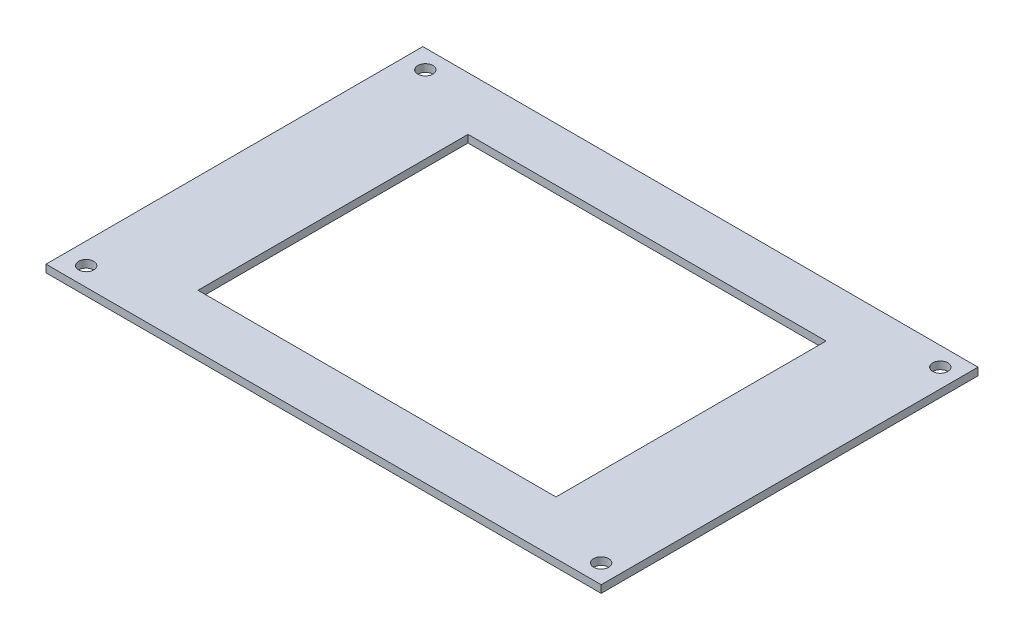
ISO-10303-21;
HEADER;
FILE_DESCRIPTION(('STEP AP214'),'2;1');
FILE_NAME('part.step','',(''),(''),'','','');
FILE_SCHEMA(('AUTOMOTIVE_DESIGN { 1 0 10303 214 1 1 1 1 }'));
ENDSEC;
DATA;
#1=APPLICATION_CONTEXT('core data for automotive mechanical design processes');
#2=APPLICATION_PROTOCOL_DEFINITION('international standard','automotive_design',2000,#1);
#3=PRODUCT_CONTEXT('',#1,'mechanical');
#4=PRODUCT('Part','Part','',(#3));
#5=PRODUCT_RELATED_PRODUCT_CATEGORY('part','',(#4));
#6=PRODUCT_DEFINITION_FORMATION('','',#4);
#7=PRODUCT_DEFINITION_CONTEXT('part definition',#1,'design');
#8=PRODUCT_DEFINITION('design','',#6,#7);
#9=PRODUCT_DEFINITION_SHAPE('','',#8);
#10=(LENGTH_UNIT() NAMED_UNIT(*) SI_UNIT(.MILLI.,.METRE.));
#11=(NAMED_UNIT(*) PLANE_ANGLE_UNIT() SI_UNIT($,.RADIAN.));
#12=(NAMED_UNIT(*) SI_UNIT($,.STERADIAN.) SOLID_ANGLE_UNIT());
#13=UNCERTAINTY_MEASURE_WITH_UNIT(LENGTH_MEASURE(1.E-05),#10,'distance_accuracy_value','');
#14=(GEOMETRIC_REPRESENTATION_CONTEXT(3) GLOBAL_UNCERTAINTY_ASSIGNED_CONTEXT((#13)) GLOBAL_UNIT_ASSIGNED_CONTEXT((#10,
#11,#12)) REPRESENTATION_CONTEXT('',''));
#15=CARTESIAN_POINT('',(0.,0.,0.));
#16=DIRECTION('',(0.,0.,1.));
#17=DIRECTION('',(1.,0.,0.));
#18=AXIS2_PLACEMENT_3D('',#15,#16,#17);
#19=CARTESIAN_POINT('',(0.,1.524,0.));
#20=DIRECTION('',(0.,-1.,0.));
#21=DIRECTION('',(0.,0.,-1.));
#22=AXIS2_PLACEMENT_3D('',#19,#20,#21);
#23=PLANE('',#22);
#24=DIRECTION('',(0.,0.,1.));
#25=VECTOR('',#24,1.);
#26=CARTESIAN_POINT('',(-56.134,1.524,38.1));
#27=LINE('',#26,#25);
#28=CARTESIAN_POINT('',(-56.134,1.524,-38.1));
#29=VERTEX_POINT('',#28);
#30=CARTESIAN_POINT('',(-56.134,1.524,38.1));
#31=VERTEX_POINT('',#30);
#32=EDGE_CURVE('E226',#29,#31,#27,.T.);
#33=ORIENTED_EDGE('',*,*,#32,.T.);
#34=DIRECTION('',(1.,0.,0.));
#35=VECTOR('',#34,1.);
#36=CARTESIAN_POINT('',(-56.134,1.524,38.1));
#37=LINE('',#36,#35);
#38=CARTESIAN_POINT('',(56.134,1.524,38.1));
#39=VERTEX_POINT('',#38);
#40=EDGE_CURVE('E240',#31,#39,#37,.T.);
#41=ORIENTED_EDGE('',*,*,#40,.T.);
#42=DIRECTION('',(0.,0.,-1.));
#43=VECTOR('',#42,1.);
#44=CARTESIAN_POINT('',(56.134,1.524,38.1));
#45=LINE('',#44,#43);
#46=CARTESIAN_POINT('',(56.134,1.524,-38.1));
#47=VERTEX_POINT('',#46);
#48=EDGE_CURVE('E220',#39,#47,#45,.T.);
#49=ORIENTED_EDGE('',*,*,#48,.T.);
#50=DIRECTION('',(-1.,0.,0.));
#51=VECTOR('',#50,1.);
#52=CARTESIAN_POINT('',(-56.134,1.524,-38.1));
#53=LINE('',#52,#51);
#54=EDGE_CURVE('E233',#47,#29,#53,.T.);
#55=ORIENTED_EDGE('',*,*,#54,.T.);
#56=EDGE_LOOP('',(#33,#41,#49,#55));
#57=FACE_BOUND('',#56,.T.);
#58=DIRECTION('',(0.,0.,-1.));
#59=VECTOR('',#58,1.);
#60=CARTESIAN_POINT('',(36.195,1.524,27.305));
#61=LINE('',#60,#59);
#62=CARTESIAN_POINT('',(36.195,1.524,27.305));
#63=VERTEX_POINT('',#62);
#64=CARTESIAN_POINT('',(36.195,1.524,-27.305));
#65=VERTEX_POINT('',#64);
#66=EDGE_CURVE('E103',#63,#65,#61,.T.);
#67=ORIENTED_EDGE('',*,*,#66,.F.);
#68=DIRECTION('',(1.,0.,0.));
#69=VECTOR('',#68,1.);
#70=CARTESIAN_POINT('',(-36.195,1.524,27.305));
#71=LINE('',#70,#69);
#72=CARTESIAN_POINT('',(-36.195,1.524,27.305));
#73=VERTEX_POINT('',#72);
#74=EDGE_CURVE('E130',#73,#63,#71,.T.);
#75=ORIENTED_EDGE('',*,*,#74,.F.);
#76=DIRECTION('',(0.,0.,1.));
#77=VECTOR('',#76,1.);
#78=CARTESIAN_POINT('',(-36.195,1.524,27.305));
#79=LINE('',#78,#77);
#80=CARTESIAN_POINT('',(-36.195,1.524,-27.305));
#81=VERTEX_POINT('',#80);
#82=EDGE_CURVE('E125',#81,#73,#79,.T.);
#83=ORIENTED_EDGE('',*,*,#82,.F.);
#84=DIRECTION('',(-1.,0.,0.));
#85=VECTOR('',#84,1.);
#86=CARTESIAN_POINT('',(-36.195,1.524,-27.305));
#87=LINE('',#86,#85);
#88=EDGE_CURVE('E112',#65,#81,#87,.T.);
#89=ORIENTED_EDGE('',*,*,#88,.F.);
#90=EDGE_LOOP('',(#67,#75,#83,#89));
#91=FACE_BOUND('',#90,.T.);
#92=CARTESIAN_POINT('',(-51.816,1.524,34.29));
#93=DIRECTION('',(0.,1.,0.));
#94=DIRECTION('',(0.,0.,1.));
#95=AXIS2_PLACEMENT_3D('',#92,#93,#94);
#96=CIRCLE('',#95,1.524);
#97=CARTESIAN_POINT('',(-51.816,1.524,32.766));
#98=VERTEX_POINT('',#97);
#99=EDGE_CURVE('E144',#98,#98,#96,.T.);
#100=ORIENTED_EDGE('',*,*,#99,.F.);
#101=EDGE_LOOP('',(#100));
#102=FACE_BOUND('',#101,.T.);
#103=CARTESIAN_POINT('',(52.324,1.524,34.29));
#104=DIRECTION('',(0.,1.,0.));
#105=DIRECTION('',(0.,0.,1.));
#106=AXIS2_PLACEMENT_3D('',#103,#104,#105);
#107=CIRCLE('',#106,1.524);
#108=CARTESIAN_POINT('',(52.324,1.524,32.766));
#109=VERTEX_POINT('',#108);
#110=EDGE_CURVE('E151',#109,#109,#107,.T.);
#111=ORIENTED_EDGE('',*,*,#110,.F.);
#112=EDGE_LOOP('',(#111));
#113=FACE_BOUND('',#112,.T.);
#114=CARTESIAN_POINT('',(52.324,1.524,-34.29));
#115=DIRECTION('',(0.,1.,0.));
#116=DIRECTION('',(0.,0.,1.));
#117=AXIS2_PLACEMENT_3D('',#114,#115,#116);
#118=CIRCLE('',#117,1.524);
#119=CARTESIAN_POINT('',(52.324,1.524,-35.814));
#120=VERTEX_POINT('',#119);
#121=EDGE_CURVE('E160',#120,#120,#118,.T.);
#122=ORIENTED_EDGE('',*,*,#121,.F.);
#123=EDGE_LOOP('',(#122));
#124=FACE_BOUND('',#123,.T.);
#125=CARTESIAN_POINT('',(-51.816,1.524,-34.29));
#126=DIRECTION('',(0.,1.,0.));
#127=DIRECTION('',(0.,0.,1.));
#128=AXIS2_PLACEMENT_3D('',#125,#126,#127);
#129=CIRCLE('',#128,1.524);
#130=CARTESIAN_POINT('',(-51.816,1.524,-35.814));
#131=VERTEX_POINT('',#130);
#132=EDGE_CURVE('E166',#131,#131,#129,.T.);
#133=ORIENTED_EDGE('',*,*,#132,.F.);
#134=EDGE_LOOP('',(#133));
#135=FACE_BOUND('',#134,.T.);
#136=ADVANCED_FACE('F38',(#57,#91,#102,#113,#124,#135),#23,.F.);
#137=CARTESIAN_POINT('',(0.,0.,0.));
#138=DIRECTION('',(0.,-1.,0.));
#139=DIRECTION('',(0.,0.,-1.));
#140=AXIS2_PLACEMENT_3D('',#137,#138,#139);
#141=PLANE('',#140);
#142=CARTESIAN_POINT('',(52.324,0.,-34.29));
#143=DIRECTION('',(0.,1.,0.));
#144=DIRECTION('',(0.,0.,1.));
#145=AXIS2_PLACEMENT_3D('',#142,#143,#144);
#146=CIRCLE('',#145,1.524);
#147=CARTESIAN_POINT('',(52.324,0.,-35.814));
#148=VERTEX_POINT('',#147);
#149=EDGE_CURVE('E163',#148,#148,#146,.T.);
#150=ORIENTED_EDGE('',*,*,#149,.T.);
#151=EDGE_LOOP('',(#150));
#152=FACE_BOUND('',#151,.T.);
#153=CARTESIAN_POINT('',(-51.816,0.,34.29));
#154=DIRECTION('',(0.,1.,0.));
#155=DIRECTION('',(0.,0.,1.));
#156=AXIS2_PLACEMENT_3D('',#153,#154,#155);
#157=CIRCLE('',#156,1.524);
#158=CARTESIAN_POINT('',(-51.816,0.,32.766));
#159=VERTEX_POINT('',#158);
#160=EDGE_CURVE('E148',#159,#159,#157,.T.);
#161=ORIENTED_EDGE('',*,*,#160,.T.);
#162=EDGE_LOOP('',(#161));
#163=FACE_BOUND('',#162,.T.);
#164=DIRECTION('',(0.,0.,1.));
#165=VECTOR('',#164,1.);
#166=CARTESIAN_POINT('',(-56.134,0.,38.1));
#167=LINE('',#166,#165);
#168=CARTESIAN_POINT('',(-56.134,0.,-38.1));
#169=VERTEX_POINT('',#168);
#170=CARTESIAN_POINT('',(-56.134,0.,38.1));
#171=VERTEX_POINT('',#170);
#172=EDGE_CURVE('E120',#169,#171,#167,.T.);
#173=ORIENTED_EDGE('',*,*,#172,.F.);
#174=DIRECTION('',(-1.,0.,0.));
#175=VECTOR('',#174,1.);
#176=CARTESIAN_POINT('',(-56.134,0.,-38.1));
#177=LINE('',#176,#175);
#178=CARTESIAN_POINT('',(56.134,0.,-38.1));
#179=VERTEX_POINT('',#178);
#180=EDGE_CURVE('E224',#179,#169,#177,.T.);
#181=ORIENTED_EDGE('',*,*,#180,.F.);
#182=DIRECTION('',(0.,0.,-1.));
#183=VECTOR('',#182,1.);
#184=CARTESIAN_POINT('',(56.134,0.,38.1));
#185=LINE('',#184,#183);
#186=CARTESIAN_POINT('',(56.134,0.,38.1));
#187=VERTEX_POINT('',#186);
#188=EDGE_CURVE('E216',#187,#179,#185,.T.);
#189=ORIENTED_EDGE('',*,*,#188,.F.);
#190=DIRECTION('',(1.,0.,0.));
#191=VECTOR('',#190,1.);
#192=CARTESIAN_POINT('',(-56.134,0.,38.1));
#193=LINE('',#192,#191);
#194=EDGE_CURVE('E208',#171,#187,#193,.T.);
#195=ORIENTED_EDGE('',*,*,#194,.F.);
#196=EDGE_LOOP('',(#173,#181,#189,#195));
#197=FACE_BOUND('',#196,.T.);
#198=DIRECTION('',(1.,0.,0.));
#199=VECTOR('',#198,1.);
#200=CARTESIAN_POINT('',(-36.195,0.,27.305));
#201=LINE('',#200,#199);
#202=CARTESIAN_POINT('',(-36.195,0.,27.305));
#203=VERTEX_POINT('',#202);
#204=CARTESIAN_POINT('',(36.195,0.,27.305));
#205=VERTEX_POINT('',#204);
#206=EDGE_CURVE('E113',#203,#205,#201,.T.);
#207=ORIENTED_EDGE('',*,*,#206,.T.);
#208=DIRECTION('',(0.,0.,-1.));
#209=VECTOR('',#208,1.);
#210=CARTESIAN_POINT('',(36.195,0.,27.305));
#211=LINE('',#210,#209);
#212=CARTESIAN_POINT('',(36.195,0.,-27.305));
#213=VERTEX_POINT('',#212);
#214=EDGE_CURVE('E61',#205,#213,#211,.T.);
#215=ORIENTED_EDGE('',*,*,#214,.T.);
#216=DIRECTION('',(-1.,0.,0.));
#217=VECTOR('',#216,1.);
#218=CARTESIAN_POINT('',(-36.195,0.,-27.305));
#219=LINE('',#218,#217);
#220=CARTESIAN_POINT('',(-36.195,0.,-27.305));
#221=VERTEX_POINT('',#220);
#222=EDGE_CURVE('E119',#213,#221,#219,.T.);
#223=ORIENTED_EDGE('',*,*,#222,.T.);
#224=DIRECTION('',(0.,0.,1.));
#225=VECTOR('',#224,1.);
#226=CARTESIAN_POINT('',(-36.195,0.,27.305));
#227=LINE('',#226,#225);
#228=EDGE_CURVE('E254',#221,#203,#227,.T.);
#229=ORIENTED_EDGE('',*,*,#228,.T.);
#230=EDGE_LOOP('',(#207,#215,#223,#229));
#231=FACE_BOUND('',#230,.T.);
#232=CARTESIAN_POINT('',(52.324,0.,34.29));
#233=DIRECTION('',(0.,1.,0.));
#234=DIRECTION('',(0.,0.,1.));
#235=AXIS2_PLACEMENT_3D('',#232,#233,#234);
#236=CIRCLE('',#235,1.524);
#237=CARTESIAN_POINT('',(52.324,0.,32.766));
#238=VERTEX_POINT('',#237);
#239=EDGE_CURVE('E149',#238,#238,#236,.T.);
#240=ORIENTED_EDGE('',*,*,#239,.T.);
#241=EDGE_LOOP('',(#240));
#242=FACE_BOUND('',#241,.T.);
#243=CARTESIAN_POINT('',(-51.816,0.,-34.29));
#244=DIRECTION('',(0.,1.,0.));
#245=DIRECTION('',(0.,0.,1.));
#246=AXIS2_PLACEMENT_3D('',#243,#244,#245);
#247=CIRCLE('',#246,1.524);
#248=CARTESIAN_POINT('',(-51.816,0.,-35.814));
#249=VERTEX_POINT('',#248);
#250=EDGE_CURVE('E170',#249,#249,#247,.T.);
#251=ORIENTED_EDGE('',*,*,#250,.T.);
#252=EDGE_LOOP('',(#251));
#253=FACE_BOUND('',#252,.T.);
#254=ADVANCED_FACE('F181',(#152,#163,#197,#231,#242,#253),#141,.T.);
#255=CARTESIAN_POINT('',(-56.134,1.524,38.1));
#256=DIRECTION('',(1.,0.,0.));
#257=DIRECTION('',(0.,0.,-1.));
#258=AXIS2_PLACEMENT_3D('',#255,#256,#257);
#259=PLANE('',#258);
#260=ORIENTED_EDGE('',*,*,#172,.T.);
#261=DIRECTION('',(0.,-1.,0.));
#262=VECTOR('',#261,1.);
#263=CARTESIAN_POINT('',(-56.134,1.524,38.1));
#264=LINE('',#263,#262);
#265=EDGE_CURVE('E12',#31,#171,#264,.T.);
#266=ORIENTED_EDGE('',*,*,#265,.F.);
#267=ORIENTED_EDGE('',*,*,#32,.F.);
#268=DIRECTION('',(0.,-1.,0.));
#269=VECTOR('',#268,1.);
#270=CARTESIAN_POINT('',(-56.134,1.524,-38.1));
#271=LINE('',#270,#269);
#272=EDGE_CURVE('E230',#29,#169,#271,.T.);
#273=ORIENTED_EDGE('',*,*,#272,.T.);
#274=EDGE_LOOP('',(#260,#266,#267,#273));
#275=FACE_BOUND('',#274,.T.);
#276=ADVANCED_FACE('F40',(#275),#259,.F.);
#277=CARTESIAN_POINT('',(-56.134,1.524,38.1));
#278=DIRECTION('',(0.,0.,-1.));
#279=DIRECTION('',(-1.,0.,0.));
#280=AXIS2_PLACEMENT_3D('',#277,#278,#279);
#281=PLANE('',#280);
#282=ORIENTED_EDGE('',*,*,#194,.T.);
#283=DIRECTION('',(0.,-1.,0.));
#284=VECTOR('',#283,1.);
#285=CARTESIAN_POINT('',(56.134,1.524,38.1));
#286=LINE('',#285,#284);
#287=EDGE_CURVE('E46',#39,#187,#286,.T.);
#288=ORIENTED_EDGE('',*,*,#287,.F.);
#289=ORIENTED_EDGE('',*,*,#40,.F.);
#290=ORIENTED_EDGE('',*,*,#265,.T.);
#291=EDGE_LOOP('',(#282,#288,#289,#290));
#292=FACE_BOUND('',#291,.T.);
#293=ADVANCED_FACE('F199',(#292),#281,.F.);
#294=CARTESIAN_POINT('',(56.134,1.524,38.1));
#295=DIRECTION('',(-1.,0.,0.));
#296=DIRECTION('',(0.,0.,1.));
#297=AXIS2_PLACEMENT_3D('',#294,#295,#296);
#298=PLANE('',#297);
#299=ORIENTED_EDGE('',*,*,#188,.T.);
#300=DIRECTION('',(0.,-1.,0.));
#301=VECTOR('',#300,1.);
#302=CARTESIAN_POINT('',(56.134,1.524,-38.1));
#303=LINE('',#302,#301);
#304=EDGE_CURVE('E221',#47,#179,#303,.T.);
#305=ORIENTED_EDGE('',*,*,#304,.F.);
#306=ORIENTED_EDGE('',*,*,#48,.F.);
#307=ORIENTED_EDGE('',*,*,#287,.T.);
#308=EDGE_LOOP('',(#299,#305,#306,#307));
#309=FACE_BOUND('',#308,.T.);
#310=ADVANCED_FACE('F196',(#309),#298,.F.);
#311=CARTESIAN_POINT('',(-56.134,1.524,-38.1));
#312=DIRECTION('',(0.,0.,1.));
#313=DIRECTION('',(1.,0.,0.));
#314=AXIS2_PLACEMENT_3D('',#311,#312,#313);
#315=PLANE('',#314);
#316=ORIENTED_EDGE('',*,*,#180,.T.);
#317=ORIENTED_EDGE('',*,*,#272,.F.);
#318=ORIENTED_EDGE('',*,*,#54,.F.);
#319=ORIENTED_EDGE('',*,*,#304,.T.);
#320=EDGE_LOOP('',(#316,#317,#318,#319));
#321=FACE_BOUND('',#320,.T.);
#322=ADVANCED_FACE('F193',(#321),#315,.F.);
#323=CARTESIAN_POINT('',(36.195,1.524,27.305));
#324=DIRECTION('',(-1.,0.,0.));
#325=DIRECTION('',(0.,0.,1.));
#326=AXIS2_PLACEMENT_3D('',#323,#324,#325);
#327=PLANE('',#326);
#328=ORIENTED_EDGE('',*,*,#214,.F.);
#329=DIRECTION('',(0.,-1.,0.));
#330=VECTOR('',#329,1.);
#331=CARTESIAN_POINT('',(36.195,1.524,27.305));
#332=LINE('',#331,#330);
#333=EDGE_CURVE('E107',#63,#205,#332,.T.);
#334=ORIENTED_EDGE('',*,*,#333,.F.);
#335=ORIENTED_EDGE('',*,*,#66,.T.);
#336=DIRECTION('',(0.,-1.,0.));
#337=VECTOR('',#336,1.);
#338=CARTESIAN_POINT('',(36.195,1.524,-27.305));
#339=LINE('',#338,#337);
#340=EDGE_CURVE('E106',#65,#213,#339,.T.);
#341=ORIENTED_EDGE('',*,*,#340,.T.);
#342=EDGE_LOOP('',(#328,#334,#335,#341));
#343=FACE_BOUND('',#342,.T.);
#344=ADVANCED_FACE('F105',(#343),#327,.T.);
#345=CARTESIAN_POINT('',(-36.195,1.524,-27.305));
#346=DIRECTION('',(0.,0.,1.));
#347=DIRECTION('',(1.,0.,0.));
#348=AXIS2_PLACEMENT_3D('',#345,#346,#347);
#349=PLANE('',#348);
#350=ORIENTED_EDGE('',*,*,#222,.F.);
#351=ORIENTED_EDGE('',*,*,#340,.F.);
#352=ORIENTED_EDGE('',*,*,#88,.T.);
#353=DIRECTION('',(0.,-1.,0.));
#354=VECTOR('',#353,1.);
#355=CARTESIAN_POINT('',(-36.195,1.524,-27.305));
#356=LINE('',#355,#354);
#357=EDGE_CURVE('E121',#81,#221,#356,.T.);
#358=ORIENTED_EDGE('',*,*,#357,.T.);
#359=EDGE_LOOP('',(#350,#351,#352,#358));
#360=FACE_BOUND('',#359,.T.);
#361=ADVANCED_FACE('F116',(#360),#349,.T.);
#362=CARTESIAN_POINT('',(-36.195,1.524,27.305));
#363=DIRECTION('',(1.,0.,0.));
#364=DIRECTION('',(0.,0.,-1.));
#365=AXIS2_PLACEMENT_3D('',#362,#363,#364);
#366=PLANE('',#365);
#367=ORIENTED_EDGE('',*,*,#228,.F.);
#368=ORIENTED_EDGE('',*,*,#357,.F.);
#369=ORIENTED_EDGE('',*,*,#82,.T.);
#370=DIRECTION('',(0.,-1.,0.));
#371=VECTOR('',#370,1.);
#372=CARTESIAN_POINT('',(-36.195,1.524,27.305));
#373=LINE('',#372,#371);
#374=EDGE_CURVE('E53',#73,#203,#373,.T.);
#375=ORIENTED_EDGE('',*,*,#374,.T.);
#376=EDGE_LOOP('',(#367,#368,#369,#375));
#377=FACE_BOUND('',#376,.T.);
#378=ADVANCED_FACE('F269',(#377),#366,.T.);
#379=CARTESIAN_POINT('',(-36.195,1.524,27.305));
#380=DIRECTION('',(0.,0.,-1.));
#381=DIRECTION('',(-1.,0.,0.));
#382=AXIS2_PLACEMENT_3D('',#379,#380,#381);
#383=PLANE('',#382);
#384=ORIENTED_EDGE('',*,*,#206,.F.);
#385=ORIENTED_EDGE('',*,*,#374,.F.);
#386=ORIENTED_EDGE('',*,*,#74,.T.);
#387=ORIENTED_EDGE('',*,*,#333,.T.);
#388=EDGE_LOOP('',(#384,#385,#386,#387));
#389=FACE_BOUND('',#388,.T.);
#390=ADVANCED_FACE('F271',(#389),#383,.T.);
#391=CARTESIAN_POINT('',(-51.816,1.524,34.29));
#392=DIRECTION('',(0.,-1.,0.));
#393=DIRECTION('',(0.,0.,-1.));
#394=AXIS2_PLACEMENT_3D('',#391,#392,#393);
#395=CYLINDRICAL_SURFACE('',#394,1.524);
#396=CARTESIAN_POINT('',(-51.816,1.524,32.766));
#397=CARTESIAN_POINT('',(-51.816,1.508125,32.766));
#398=CARTESIAN_POINT('',(-51.816,1.49225,32.766));
#399=CARTESIAN_POINT('',(-51.816,1.4605,32.766));
#400=CARTESIAN_POINT('',(-51.816,1.444625,32.766));
#401=CARTESIAN_POINT('',(-51.816,1.412875,32.766));
#402=CARTESIAN_POINT('',(-51.816,1.397,32.766));
#403=CARTESIAN_POINT('',(-51.816,1.36525,32.766));
#404=CARTESIAN_POINT('',(-51.816,1.349375,32.766));
#405=CARTESIAN_POINT('',(-51.816,1.317625,32.766));
#406=CARTESIAN_POINT('',(-51.816,1.30175,32.766));
#407=CARTESIAN_POINT('',(-51.816,1.27,32.766));
#408=CARTESIAN_POINT('',(-51.816,1.254125,32.766));
#409=CARTESIAN_POINT('',(-51.816,1.222375,32.766));
#410=CARTESIAN_POINT('',(-51.816,1.2065,32.766));
#411=CARTESIAN_POINT('',(-51.816,1.17475,32.766));
#412=CARTESIAN_POINT('',(-51.816,1.158875,32.766));
#413=CARTESIAN_POINT('',(-51.816,1.127125,32.766));
#414=CARTESIAN_POINT('',(-51.816,1.11125,32.766));
#415=CARTESIAN_POINT('',(-51.816,1.0795,32.766));
#416=CARTESIAN_POINT('',(-51.816,1.063625,32.766));
#417=CARTESIAN_POINT('',(-51.816,1.031875,32.766));
#418=CARTESIAN_POINT('',(-51.816,1.016,32.766));
#419=CARTESIAN_POINT('',(-51.816,0.98425,32.766));
#420=CARTESIAN_POINT('',(-51.816,0.968375,32.766));
#421=CARTESIAN_POINT('',(-51.816,0.936625,32.766));
#422=CARTESIAN_POINT('',(-51.816,0.92075,32.766));
#423=CARTESIAN_POINT('',(-51.816,0.889,32.766));
#424=CARTESIAN_POINT('',(-51.816,0.873125,32.766));
#425=CARTESIAN_POINT('',(-51.816,0.841375,32.766));
#426=CARTESIAN_POINT('',(-51.816,0.8255,32.766));
#427=CARTESIAN_POINT('',(-51.816,0.79375,32.766));
#428=CARTESIAN_POINT('',(-51.816,0.777875,32.766));
#429=CARTESIAN_POINT('',(-51.816,0.746125,32.766));
#430=CARTESIAN_POINT('',(-51.816,0.73025,32.766));
#431=CARTESIAN_POINT('',(-51.816,0.6985,32.766));
#432=CARTESIAN_POINT('',(-51.816,0.682625,32.766));
#433=CARTESIAN_POINT('',(-51.816,0.650875,32.766));
#434=CARTESIAN_POINT('',(-51.816,0.635,32.766));
#435=CARTESIAN_POINT('',(-51.816,0.60325,32.766));
#436=CARTESIAN_POINT('',(-51.816,0.587375,32.766));
#437=CARTESIAN_POINT('',(-51.816,0.555625,32.766));
#438=CARTESIAN_POINT('',(-51.816,0.53975,32.766));
#439=CARTESIAN_POINT('',(-51.816,0.508,32.766));
#440=CARTESIAN_POINT('',(-51.816,0.492125,32.766));
#441=CARTESIAN_POINT('',(-51.816,0.460375,32.766));
#442=CARTESIAN_POINT('',(-51.816,0.4445,32.766));
#443=CARTESIAN_POINT('',(-51.816,0.41275,32.766));
#444=CARTESIAN_POINT('',(-51.816,0.396875,32.766));
#445=CARTESIAN_POINT('',(-51.816,0.365125,32.766));
#446=CARTESIAN_POINT('',(-51.816,0.34925,32.766));
#447=CARTESIAN_POINT('',(-51.816,0.3175,32.766));
#448=CARTESIAN_POINT('',(-51.816,0.301625,32.766));
#449=CARTESIAN_POINT('',(-51.816,0.269875,32.766));
#450=CARTESIAN_POINT('',(-51.816,0.254,32.766));
#451=CARTESIAN_POINT('',(-51.816,0.22225,32.766));
#452=CARTESIAN_POINT('',(-51.816,0.206375,32.766));
#453=CARTESIAN_POINT('',(-51.816,0.174625,32.766));
#454=CARTESIAN_POINT('',(-51.816,0.15875,32.766));
#455=CARTESIAN_POINT('',(-51.816,0.127,32.766));
#456=CARTESIAN_POINT('',(-51.816,0.111125,32.766));
#457=CARTESIAN_POINT('',(-51.816,0.079375,32.766));
#458=CARTESIAN_POINT('',(-51.816,0.0635,32.766));
#459=CARTESIAN_POINT('',(-51.816,0.0317499999999999,32.766));
#460=CARTESIAN_POINT('',(-51.816,0.015875,32.766));
#461=CARTESIAN_POINT('',(-51.816,0.,32.766));
#462=B_SPLINE_CURVE_WITH_KNOTS('',3,(#396,#397,#398,#399,#400,#401,#402,#403,#404,#405,#406,
#407,#408,#409,#410,#411,#412,#413,#414,#415,#416,#417,#418,#419,#420,#421,#422,#423,#424,#425,
#426,#427,#428,#429,#430,#431,#432,#433,#434,#435,#436,#437,#438,#439,#440,#441,#442,#443,#444,
#445,#446,#447,#448,#449,#450,#451,#452,#453,#454,#455,#456,#457,#458,#459,#460,#461),
.UNSPECIFIED.,.F.,.F.,(4,2,2,2,2,2,2,2,2,2,2,2,2,2,2,2,2,2,2,2,2,2,2,2,2,2,2,2,2,2,2,2,4),(0.,
0.0476249999999999,0.0952499999999998,0.142875,0.1905,0.238125,0.28575,0.333375,0.381,0.428625,
0.47625,0.523875,0.5715,0.619125,0.66675,0.714375,0.762,0.809625,0.85725,0.904875,0.9525,
1.000125,1.04775,1.095375,1.143,1.190625,1.23825,1.285875,1.3335,1.381125,1.42875,1.476375,
1.524),.UNSPECIFIED.);
#463=EDGE_CURVE('BSEAM273',#98,#159,#462,.T.);
#464=ORIENTED_EDGE('',*,*,#99,.T.);
#465=ORIENTED_EDGE('',*,*,#160,.F.);
#466=ORIENTED_EDGE('',*,*,#463,.T.);
#467=ORIENTED_EDGE('',*,*,#463,.F.);
#468=EDGE_LOOP('',(#464,#466,#465,#467));
#469=FACE_BOUND('',#468,.T.);
#470=ADVANCED_FACE('F273',(#469),#395,.F.);
#471=CARTESIAN_POINT('',(52.324,1.524,34.29));
#472=DIRECTION('',(0.,-1.,0.));
#473=DIRECTION('',(0.,0.,-1.));
#474=AXIS2_PLACEMENT_3D('',#471,#472,#473);
#475=CYLINDRICAL_SURFACE('',#474,1.524);
#476=CARTESIAN_POINT('',(52.324,1.524,32.766));
#477=CARTESIAN_POINT('',(52.324,1.508125,32.766));
#478=CARTESIAN_POINT('',(52.324,1.49225,32.766));
#479=CARTESIAN_POINT('',(52.324,1.4605,32.766));
#480=CARTESIAN_POINT('',(52.324,1.444625,32.766));
#481=CARTESIAN_POINT('',(52.324,1.412875,32.766));
#482=CARTESIAN_POINT('',(52.324,1.397,32.766));
#483=CARTESIAN_POINT('',(52.324,1.36525,32.766));
#484=CARTESIAN_POINT('',(52.324,1.349375,32.766));
#485=CARTESIAN_POINT('',(52.324,1.317625,32.766));
#486=CARTESIAN_POINT('',(52.324,1.30175,32.766));
#487=CARTESIAN_POINT('',(52.324,1.27,32.766));
#488=CARTESIAN_POINT('',(52.324,1.254125,32.766));
#489=CARTESIAN_POINT('',(52.324,1.222375,32.766));
#490=CARTESIAN_POINT('',(52.324,1.2065,32.766));
#491=CARTESIAN_POINT('',(52.324,1.17475,32.766));
#492=CARTESIAN_POINT('',(52.324,1.158875,32.766));
#493=CARTESIAN_POINT('',(52.324,1.127125,32.766));
#494=CARTESIAN_POINT('',(52.324,1.11125,32.766));
#495=CARTESIAN_POINT('',(52.324,1.0795,32.766));
#496=CARTESIAN_POINT('',(52.324,1.063625,32.766));
#497=CARTESIAN_POINT('',(52.324,1.031875,32.766));
#498=CARTESIAN_POINT('',(52.324,1.016,32.766));
#499=CARTESIAN_POINT('',(52.324,0.98425,32.766));
#500=CARTESIAN_POINT('',(52.324,0.968375,32.766));
#501=CARTESIAN_POINT('',(52.324,0.936625,32.766));
#502=CARTESIAN_POINT('',(52.324,0.92075,32.766));
#503=CARTESIAN_POINT('',(52.324,0.889,32.766));
#504=CARTESIAN_POINT('',(52.324,0.873125,32.766));
#505=CARTESIAN_POINT('',(52.324,0.841375,32.766));
#506=CARTESIAN_POINT('',(52.324,0.8255,32.766));
#507=CARTESIAN_POINT('',(52.324,0.79375,32.766));
#508=CARTESIAN_POINT('',(52.324,0.777875,32.766));
#509=CARTESIAN_POINT('',(52.324,0.746125,32.766));
#510=CARTESIAN_POINT('',(52.324,0.73025,32.766));
#511=CARTESIAN_POINT('',(52.324,0.6985,32.766));
#512=CARTESIAN_POINT('',(52.324,0.682625,32.766));
#513=CARTESIAN_POINT('',(52.324,0.650875,32.766));
#514=CARTESIAN_POINT('',(52.324,0.635,32.766));
#515=CARTESIAN_POINT('',(52.324,0.60325,32.766));
#516=CARTESIAN_POINT('',(52.324,0.587375,32.766));
#517=CARTESIAN_POINT('',(52.324,0.555625,32.766));
#518=CARTESIAN_POINT('',(52.324,0.53975,32.766));
#519=CARTESIAN_POINT('',(52.324,0.508,32.766));
#520=CARTESIAN_POINT('',(52.324,0.492125,32.766));
#521=CARTESIAN_POINT('',(52.324,0.460375,32.766));
#522=CARTESIAN_POINT('',(52.324,0.4445,32.766));
#523=CARTESIAN_POINT('',(52.324,0.41275,32.766));
#524=CARTESIAN_POINT('',(52.324,0.396875,32.766));
#525=CARTESIAN_POINT('',(52.324,0.365125,32.766));
#526=CARTESIAN_POINT('',(52.324,0.34925,32.766));
#527=CARTESIAN_POINT('',(52.324,0.3175,32.766));
#528=CARTESIAN_POINT('',(52.324,0.301625,32.766));
#529=CARTESIAN_POINT('',(52.324,0.269875,32.766));
#530=CARTESIAN_POINT('',(52.324,0.254,32.766));
#531=CARTESIAN_POINT('',(52.324,0.22225,32.766));
#532=CARTESIAN_POINT('',(52.324,0.206375,32.766));
#533=CARTESIAN_POINT('',(52.324,0.174625,32.766));
#534=CARTESIAN_POINT('',(52.324,0.15875,32.766));
#535=CARTESIAN_POINT('',(52.324,0.127,32.766));
#536=CARTESIAN_POINT('',(52.324,0.111125,32.766));
#537=CARTESIAN_POINT('',(52.324,0.079375,32.766));
#538=CARTESIAN_POINT('',(52.324,0.0635,32.766));
#539=CARTESIAN_POINT('',(52.324,0.0317499999999999,32.766));
#540=CARTESIAN_POINT('',(52.324,0.015875,32.766));
#541=CARTESIAN_POINT('',(52.324,0.,32.766));
#542=B_SPLINE_CURVE_WITH_KNOTS('',3,(#476,#477,#478,#479,#480,#481,#482,#483,#484,#485,#486,
#487,#488,#489,#490,#491,#492,#493,#494,#495,#496,#497,#498,#499,#500,#501,#502,#503,#504,#505,
#506,#507,#508,#509,#510,#511,#512,#513,#514,#515,#516,#517,#518,#519,#520,#521,#522,#523,#524,
#525,#526,#527,#528,#529,#530,#531,#532,#533,#534,#535,#536,#537,#538,#539,#540,#541),
.UNSPECIFIED.,.F.,.F.,(4,2,2,2,2,2,2,2,2,2,2,2,2,2,2,2,2,2,2,2,2,2,2,2,2,2,2,2,2,2,2,2,4),(0.,
0.0476249999999999,0.0952499999999998,0.142875,0.1905,0.238125,0.28575,0.333375,0.381,0.428625,
0.47625,0.523875,0.5715,0.619125,0.66675,0.714375,0.762,0.809625,0.85725,0.904875,0.9525,
1.000125,1.04775,1.095375,1.143,1.190625,1.23825,1.285875,1.3335,1.381125,1.42875,1.476375,
1.524),.UNSPECIFIED.);
#543=EDGE_CURVE('BSEAM279',#109,#238,#542,.T.);
#544=ORIENTED_EDGE('',*,*,#110,.T.);
#545=ORIENTED_EDGE('',*,*,#239,.F.);
#546=ORIENTED_EDGE('',*,*,#543,.T.);
#547=ORIENTED_EDGE('',*,*,#543,.F.);
#548=EDGE_LOOP('',(#544,#546,#545,#547));
#549=FACE_BOUND('',#548,.T.);
#550=ADVANCED_FACE('F279',(#549),#475,.F.);
#551=CARTESIAN_POINT('',(52.324,1.524,-34.29));
#552=DIRECTION('',(0.,-1.,0.));
#553=DIRECTION('',(0.,0.,-1.));
#554=AXIS2_PLACEMENT_3D('',#551,#552,#553);
#555=CYLINDRICAL_SURFACE('',#554,1.524);
#556=CARTESIAN_POINT('',(52.324,1.524,-35.814));
#557=CARTESIAN_POINT('',(52.324,1.508125,-35.814));
#558=CARTESIAN_POINT('',(52.324,1.49225,-35.814));
#559=CARTESIAN_POINT('',(52.324,1.4605,-35.814));
#560=CARTESIAN_POINT('',(52.324,1.444625,-35.814));
#561=CARTESIAN_POINT('',(52.324,1.412875,-35.814));
#562=CARTESIAN_POINT('',(52.324,1.397,-35.814));
#563=CARTESIAN_POINT('',(52.324,1.36525,-35.814));
#564=CARTESIAN_POINT('',(52.324,1.349375,-35.814));
#565=CARTESIAN_POINT('',(52.324,1.317625,-35.814));
#566=CARTESIAN_POINT('',(52.324,1.30175,-35.814));
#567=CARTESIAN_POINT('',(52.324,1.27,-35.814));
#568=CARTESIAN_POINT('',(52.324,1.254125,-35.814));
#569=CARTESIAN_POINT('',(52.324,1.222375,-35.814));
#570=CARTESIAN_POINT('',(52.324,1.2065,-35.814));
#571=CARTESIAN_POINT('',(52.324,1.17475,-35.814));
#572=CARTESIAN_POINT('',(52.324,1.158875,-35.814));
#573=CARTESIAN_POINT('',(52.324,1.127125,-35.814));
#574=CARTESIAN_POINT('',(52.324,1.11125,-35.814));
#575=CARTESIAN_POINT('',(52.324,1.0795,-35.814));
#576=CARTESIAN_POINT('',(52.324,1.063625,-35.814));
#577=CARTESIAN_POINT('',(52.324,1.031875,-35.814));
#578=CARTESIAN_POINT('',(52.324,1.016,-35.814));
#579=CARTESIAN_POINT('',(52.324,0.98425,-35.814));
#580=CARTESIAN_POINT('',(52.324,0.968375,-35.814));
#581=CARTESIAN_POINT('',(52.324,0.936625,-35.814));
#582=CARTESIAN_POINT('',(52.324,0.92075,-35.814));
#583=CARTESIAN_POINT('',(52.324,0.889,-35.814));
#584=CARTESIAN_POINT('',(52.324,0.873125,-35.814));
#585=CARTESIAN_POINT('',(52.324,0.841375,-35.814));
#586=CARTESIAN_POINT('',(52.324,0.8255,-35.814));
#587=CARTESIAN_POINT('',(52.324,0.79375,-35.814));
#588=CARTESIAN_POINT('',(52.324,0.777875,-35.814));
#589=CARTESIAN_POINT('',(52.324,0.746125,-35.814));
#590=CARTESIAN_POINT('',(52.324,0.73025,-35.814));
#591=CARTESIAN_POINT('',(52.324,0.6985,-35.814));
#592=CARTESIAN_POINT('',(52.324,0.682625,-35.814));
#593=CARTESIAN_POINT('',(52.324,0.650875,-35.814));
#594=CARTESIAN_POINT('',(52.324,0.635,-35.814));
#595=CARTESIAN_POINT('',(52.324,0.60325,-35.814));
#596=CARTESIAN_POINT('',(52.324,0.587375,-35.814));
#597=CARTESIAN_POINT('',(52.324,0.555625,-35.814));
#598=CARTESIAN_POINT('',(52.324,0.53975,-35.814));
#599=CARTESIAN_POINT('',(52.324,0.508,-35.814));
#600=CARTESIAN_POINT('',(52.324,0.492125,-35.814));
#601=CARTESIAN_POINT('',(52.324,0.460375,-35.814));
#602=CARTESIAN_POINT('',(52.324,0.4445,-35.814));
#603=CARTESIAN_POINT('',(52.324,0.41275,-35.814));
#604=CARTESIAN_POINT('',(52.324,0.396875,-35.814));
#605=CARTESIAN_POINT('',(52.324,0.365125,-35.814));
#606=CARTESIAN_POINT('',(52.324,0.34925,-35.814));
#607=CARTESIAN_POINT('',(52.324,0.3175,-35.814));
#608=CARTESIAN_POINT('',(52.324,0.301625,-35.814));
#609=CARTESIAN_POINT('',(52.324,0.269875,-35.814));
#610=CARTESIAN_POINT('',(52.324,0.254,-35.814));
#611=CARTESIAN_POINT('',(52.324,0.22225,-35.814));
#612=CARTESIAN_POINT('',(52.324,0.206375,-35.814));
#613=CARTESIAN_POINT('',(52.324,0.174625,-35.814));
#614=CARTESIAN_POINT('',(52.324,0.15875,-35.814));
#615=CARTESIAN_POINT('',(52.324,0.127,-35.814));
#616=CARTESIAN_POINT('',(52.324,0.111125,-35.814));
#617=CARTESIAN_POINT('',(52.324,0.079375,-35.814));
#618=CARTESIAN_POINT('',(52.324,0.0635,-35.814));
#619=CARTESIAN_POINT('',(52.324,0.0317499999999999,-35.814));
#620=CARTESIAN_POINT('',(52.324,0.015875,-35.814));
#621=CARTESIAN_POINT('',(52.324,0.,-35.814));
#622=B_SPLINE_CURVE_WITH_KNOTS('',3,(#556,#557,#558,#559,#560,#561,#562,#563,#564,#565,#566,
#567,#568,#569,#570,#571,#572,#573,#574,#575,#576,#577,#578,#579,#580,#581,#582,#583,#584,#585,
#586,#587,#588,#589,#590,#591,#592,#593,#594,#595,#596,#597,#598,#599,#600,#601,#602,#603,#604,
#605,#606,#607,#608,#609,#610,#611,#612,#613,#614,#615,#616,#617,#618,#619,#620,#621),
.UNSPECIFIED.,.F.,.F.,(4,2,2,2,2,2,2,2,2,2,2,2,2,2,2,2,2,2,2,2,2,2,2,2,2,2,2,2,2,2,2,2,4),(0.,
0.0476249999999999,0.0952499999999998,0.142875,0.1905,0.238125,0.28575,0.333375,0.381,0.428625,
0.47625,0.523875,0.5715,0.619125,0.66675,0.714375,0.762,0.809625,0.85725,0.904875,0.9525,
1.000125,1.04775,1.095375,1.143,1.190625,1.23825,1.285875,1.3335,1.381125,1.42875,1.476375,
1.524),.UNSPECIFIED.);
#623=EDGE_CURVE('BSEAM350',#120,#148,#622,.T.);
#624=ORIENTED_EDGE('',*,*,#121,.T.);
#625=ORIENTED_EDGE('',*,*,#149,.F.);
#626=ORIENTED_EDGE('',*,*,#623,.T.);
#627=ORIENTED_EDGE('',*,*,#623,.F.);
#628=EDGE_LOOP('',(#624,#626,#625,#627));
#629=FACE_BOUND('',#628,.T.);
#630=ADVANCED_FACE('F350',(#629),#555,.F.);
#631=CARTESIAN_POINT('',(-51.816,1.524,-34.29));
#632=DIRECTION('',(0.,-1.,0.));
#633=DIRECTION('',(0.,0.,-1.));
#634=AXIS2_PLACEMENT_3D('',#631,#632,#633);
#635=CYLINDRICAL_SURFACE('',#634,1.524);
#636=CARTESIAN_POINT('',(-51.816,1.524,-35.814));
#637=CARTESIAN_POINT('',(-51.816,1.508125,-35.814));
#638=CARTESIAN_POINT('',(-51.816,1.49225,-35.814));
#639=CARTESIAN_POINT('',(-51.816,1.4605,-35.814));
#640=CARTESIAN_POINT('',(-51.816,1.444625,-35.814));
#641=CARTESIAN_POINT('',(-51.816,1.412875,-35.814));
#642=CARTESIAN_POINT('',(-51.816,1.397,-35.814));
#643=CARTESIAN_POINT('',(-51.816,1.36525,-35.814));
#644=CARTESIAN_POINT('',(-51.816,1.349375,-35.814));
#645=CARTESIAN_POINT('',(-51.816,1.317625,-35.814));
#646=CARTESIAN_POINT('',(-51.816,1.30175,-35.814));
#647=CARTESIAN_POINT('',(-51.816,1.27,-35.814));
#648=CARTESIAN_POINT('',(-51.816,1.254125,-35.814));
#649=CARTESIAN_POINT('',(-51.816,1.222375,-35.814));
#650=CARTESIAN_POINT('',(-51.816,1.2065,-35.814));
#651=CARTESIAN_POINT('',(-51.816,1.17475,-35.814));
#652=CARTESIAN_POINT('',(-51.816,1.158875,-35.814));
#653=CARTESIAN_POINT('',(-51.816,1.127125,-35.814));
#654=CARTESIAN_POINT('',(-51.816,1.11125,-35.814));
#655=CARTESIAN_POINT('',(-51.816,1.0795,-35.814));
#656=CARTESIAN_POINT('',(-51.816,1.063625,-35.814));
#657=CARTESIAN_POINT('',(-51.816,1.031875,-35.814));
#658=CARTESIAN_POINT('',(-51.816,1.016,-35.814));
#659=CARTESIAN_POINT('',(-51.816,0.98425,-35.814));
#660=CARTESIAN_POINT('',(-51.816,0.968375,-35.814));
#661=CARTESIAN_POINT('',(-51.816,0.936625,-35.814));
#662=CARTESIAN_POINT('',(-51.816,0.92075,-35.814));
#663=CARTESIAN_POINT('',(-51.816,0.889,-35.814));
#664=CARTESIAN_POINT('',(-51.816,0.873125,-35.814));
#665=CARTESIAN_POINT('',(-51.816,0.841375,-35.814));
#666=CARTESIAN_POINT('',(-51.816,0.8255,-35.814));
#667=CARTESIAN_POINT('',(-51.816,0.79375,-35.814));
#668=CARTESIAN_POINT('',(-51.816,0.777875,-35.814));
#669=CARTESIAN_POINT('',(-51.816,0.746125,-35.814));
#670=CARTESIAN_POINT('',(-51.816,0.73025,-35.814));
#671=CARTESIAN_POINT('',(-51.816,0.6985,-35.814));
#672=CARTESIAN_POINT('',(-51.816,0.682625,-35.814));
#673=CARTESIAN_POINT('',(-51.816,0.650875,-35.814));
#674=CARTESIAN_POINT('',(-51.816,0.635,-35.814));
#675=CARTESIAN_POINT('',(-51.816,0.60325,-35.814));
#676=CARTESIAN_POINT('',(-51.816,0.587375,-35.814));
#677=CARTESIAN_POINT('',(-51.816,0.555625,-35.814));
#678=CARTESIAN_POINT('',(-51.816,0.53975,-35.814));
#679=CARTESIAN_POINT('',(-51.816,0.508,-35.814));
#680=CARTESIAN_POINT('',(-51.816,0.492125,-35.814));
#681=CARTESIAN_POINT('',(-51.816,0.460375,-35.814));
#682=CARTESIAN_POINT('',(-51.816,0.4445,-35.814));
#683=CARTESIAN_POINT('',(-51.816,0.41275,-35.814));
#684=CARTESIAN_POINT('',(-51.816,0.396875,-35.814));
#685=CARTESIAN_POINT('',(-51.816,0.365125,-35.814));
#686=CARTESIAN_POINT('',(-51.816,0.34925,-35.814));
#687=CARTESIAN_POINT('',(-51.816,0.3175,-35.814));
#688=CARTESIAN_POINT('',(-51.816,0.301625,-35.814));
#689=CARTESIAN_POINT('',(-51.816,0.269875,-35.814));
#690=CARTESIAN_POINT('',(-51.816,0.254,-35.814));
#691=CARTESIAN_POINT('',(-51.816,0.22225,-35.814));
#692=CARTESIAN_POINT('',(-51.816,0.206375,-35.814));
#693=CARTESIAN_POINT('',(-51.816,0.174625,-35.814));
#694=CARTESIAN_POINT('',(-51.816,0.15875,-35.814));
#695=CARTESIAN_POINT('',(-51.816,0.127,-35.814));
#696=CARTESIAN_POINT('',(-51.816,0.111125,-35.814));
#697=CARTESIAN_POINT('',(-51.816,0.079375,-35.814));
#698=CARTESIAN_POINT('',(-51.816,0.0635,-35.814));
#699=CARTESIAN_POINT('',(-51.816,0.0317499999999999,-35.814));
#700=CARTESIAN_POINT('',(-51.816,0.015875,-35.814));
#701=CARTESIAN_POINT('',(-51.816,0.,-35.814));
#702=B_SPLINE_CURVE_WITH_KNOTS('',3,(#636,#637,#638,#639,#640,#641,#642,#643,#644,#645,#646,
#647,#648,#649,#650,#651,#652,#653,#654,#655,#656,#657,#658,#659,#660,#661,#662,#663,#664,#665,
#666,#667,#668,#669,#670,#671,#672,#673,#674,#675,#676,#677,#678,#679,#680,#681,#682,#683,#684,
#685,#686,#687,#688,#689,#690,#691,#692,#693,#694,#695,#696,#697,#698,#699,#700,#701),
.UNSPECIFIED.,.F.,.F.,(4,2,2,2,2,2,2,2,2,2,2,2,2,2,2,2,2,2,2,2,2,2,2,2,2,2,2,2,2,2,2,2,4),(0.,
0.0476249999999999,0.0952499999999998,0.142875,0.1905,0.238125,0.28575,0.333375,0.381,0.428625,
0.47625,0.523875,0.5715,0.619125,0.66675,0.714375,0.762,0.809625,0.85725,0.904875,0.9525,
1.000125,1.04775,1.095375,1.143,1.190625,1.23825,1.285875,1.3335,1.381125,1.42875,1.476375,
1.524),.UNSPECIFIED.);
#703=EDGE_CURVE('BSEAM177',#131,#249,#702,.T.);
#704=ORIENTED_EDGE('',*,*,#132,.T.);
#705=ORIENTED_EDGE('',*,*,#250,.F.);
#706=ORIENTED_EDGE('',*,*,#703,.T.);
#707=ORIENTED_EDGE('',*,*,#703,.F.);
#708=EDGE_LOOP('',(#704,#706,#705,#707));
#709=FACE_BOUND('',#708,.T.);
#710=ADVANCED_FACE('F177',(#709),#635,.F.);
#711=CLOSED_SHELL('',(#136,#254,#276,#293,#310,#322,#344,#361,#378,#390,#470,#550,#630,#710));
#712=MANIFOLD_SOLID_BREP('B2',#711);
#713=ADVANCED_BREP_SHAPE_REPRESENTATION('',(#18,#712),#14);
#714=SHAPE_DEFINITION_REPRESENTATION(#9,#713);
ENDSEC;
END-ISO-10303-21;
